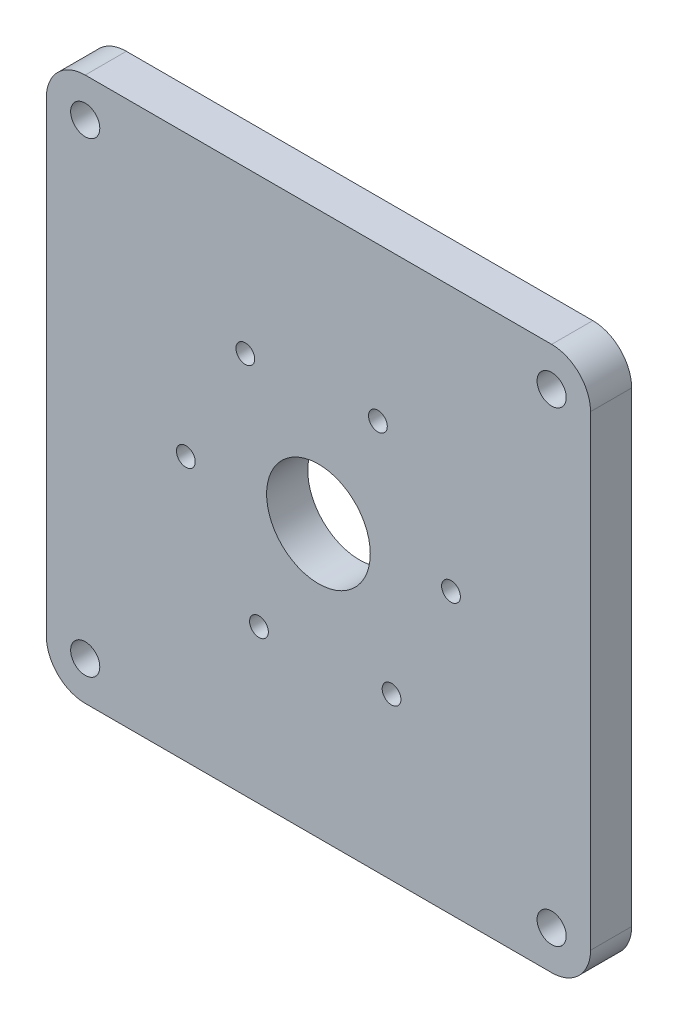
ISO-10303-21;
HEADER;
FILE_DESCRIPTION(('STEP AP214'),'2;1');
FILE_NAME('part.step','',(''),(''),'','','');
FILE_SCHEMA(('AUTOMOTIVE_DESIGN { 1 0 10303 214 1 1 1 1 }'));
ENDSEC;
DATA;
#1=APPLICATION_CONTEXT('core data for automotive mechanical design processes');
#2=APPLICATION_PROTOCOL_DEFINITION('international standard','automotive_design',2000,#1);
#3=PRODUCT_CONTEXT('',#1,'mechanical');
#4=PRODUCT('Part','Part','',(#3));
#5=PRODUCT_RELATED_PRODUCT_CATEGORY('part','',(#4));
#6=PRODUCT_DEFINITION_FORMATION('','',#4);
#7=PRODUCT_DEFINITION_CONTEXT('part definition',#1,'design');
#8=PRODUCT_DEFINITION('design','',#6,#7);
#9=PRODUCT_DEFINITION_SHAPE('','',#8);
#10=(LENGTH_UNIT() NAMED_UNIT(*) SI_UNIT(.MILLI.,.METRE.));
#11=(NAMED_UNIT(*) PLANE_ANGLE_UNIT() SI_UNIT($,.RADIAN.));
#12=(NAMED_UNIT(*) SI_UNIT($,.STERADIAN.) SOLID_ANGLE_UNIT());
#13=UNCERTAINTY_MEASURE_WITH_UNIT(LENGTH_MEASURE(1.E-05),#10,'distance_accuracy_value','');
#14=(GEOMETRIC_REPRESENTATION_CONTEXT(3) GLOBAL_UNCERTAINTY_ASSIGNED_CONTEXT((#13)) GLOBAL_UNIT_ASSIGNED_CONTEXT((#10,
#11,#12)) REPRESENTATION_CONTEXT('',''));
#15=CARTESIAN_POINT('',(0.,0.,0.));
#16=DIRECTION('',(0.,0.,1.));
#17=DIRECTION('',(1.,0.,0.));
#18=AXIS2_PLACEMENT_3D('',#15,#16,#17);
#19=CARTESIAN_POINT('',(-36.,-36.,42.85));
#20=DIRECTION('',(0.,0.,-1.));
#21=DIRECTION('',(-1.,0.,0.));
#22=AXIS2_PLACEMENT_3D('',#19,#20,#21);
#23=CYLINDRICAL_SURFACE('',#22,6.);
#24=CARTESIAN_POINT('',(-36.,-36.,36.5));
#25=DIRECTION('',(0.,0.,1.));
#26=DIRECTION('',(1.,0.,0.));
#27=AXIS2_PLACEMENT_3D('',#24,#25,#26);
#28=CIRCLE('',#27,6.);
#29=CARTESIAN_POINT('',(-42.,-36.,36.5));
#30=VERTEX_POINT('',#29);
#31=CARTESIAN_POINT('',(-36.,-42.,36.5));
#32=VERTEX_POINT('',#31);
#33=EDGE_CURVE('E146',#30,#32,#28,.T.);
#34=ORIENTED_EDGE('',*,*,#33,.T.);
#35=DIRECTION('',(0.,0.,-1.));
#36=VECTOR('',#35,1.);
#37=CARTESIAN_POINT('',(-36.,-42.,42.85));
#38=LINE('',#37,#36);
#39=CARTESIAN_POINT('',(-36.,-42.,42.85));
#40=VERTEX_POINT('',#39);
#41=EDGE_CURVE('E11',#40,#32,#38,.T.);
#42=ORIENTED_EDGE('',*,*,#41,.F.);
#43=CARTESIAN_POINT('',(-36.,-36.,42.85));
#44=DIRECTION('',(0.,0.,1.));
#45=DIRECTION('',(1.,0.,0.));
#46=AXIS2_PLACEMENT_3D('',#43,#44,#45);
#47=CIRCLE('',#46,6.);
#48=CARTESIAN_POINT('',(-42.,-36.,42.85));
#49=VERTEX_POINT('',#48);
#50=EDGE_CURVE('E172',#49,#40,#47,.T.);
#51=ORIENTED_EDGE('',*,*,#50,.F.);
#52=DIRECTION('',(0.,0.,-1.));
#53=VECTOR('',#52,1.);
#54=CARTESIAN_POINT('',(-42.,-36.,42.85));
#55=LINE('',#54,#53);
#56=EDGE_CURVE('E145',#49,#30,#55,.T.);
#57=ORIENTED_EDGE('',*,*,#56,.T.);
#58=EDGE_LOOP('',(#34,#42,#51,#57));
#59=FACE_BOUND('',#58,.T.);
#60=ADVANCED_FACE('F44',(#59),#23,.T.);
#61=CARTESIAN_POINT('',(-36.,-42.,42.85));
#62=DIRECTION('',(0.,1.,0.));
#63=DIRECTION('',(0.,0.,1.));
#64=AXIS2_PLACEMENT_3D('',#61,#62,#63);
#65=PLANE('',#64);
#66=DIRECTION('',(1.,0.,0.));
#67=VECTOR('',#66,1.);
#68=CARTESIAN_POINT('',(-36.,-42.,36.5));
#69=LINE('',#68,#67);
#70=CARTESIAN_POINT('',(36.,-42.,36.5));
#71=VERTEX_POINT('',#70);
#72=EDGE_CURVE('E155',#32,#71,#69,.T.);
#73=ORIENTED_EDGE('',*,*,#72,.T.);
#74=DIRECTION('',(0.,0.,-1.));
#75=VECTOR('',#74,1.);
#76=CARTESIAN_POINT('',(36.,-42.,42.85));
#77=LINE('',#76,#75);
#78=CARTESIAN_POINT('',(36.,-42.,42.85));
#79=VERTEX_POINT('',#78);
#80=EDGE_CURVE('E54',#79,#71,#77,.T.);
#81=ORIENTED_EDGE('',*,*,#80,.F.);
#82=DIRECTION('',(1.,0.,0.));
#83=VECTOR('',#82,1.);
#84=CARTESIAN_POINT('',(-36.,-42.,42.85));
#85=LINE('',#84,#83);
#86=EDGE_CURVE('E110',#40,#79,#85,.T.);
#87=ORIENTED_EDGE('',*,*,#86,.F.);
#88=ORIENTED_EDGE('',*,*,#41,.T.);
#89=EDGE_LOOP('',(#73,#81,#87,#88));
#90=FACE_BOUND('',#89,.T.);
#91=ADVANCED_FACE('F356',(#90),#65,.F.);
#92=CARTESIAN_POINT('',(36.,-36.,42.85));
#93=DIRECTION('',(0.,0.,-1.));
#94=DIRECTION('',(-1.,0.,0.));
#95=AXIS2_PLACEMENT_3D('',#92,#93,#94);
#96=CYLINDRICAL_SURFACE('',#95,6.);
#97=CARTESIAN_POINT('',(36.,-36.,36.5));
#98=DIRECTION('',(0.,0.,1.));
#99=DIRECTION('',(1.,0.,0.));
#100=AXIS2_PLACEMENT_3D('',#97,#98,#99);
#101=CIRCLE('',#100,6.);
#102=CARTESIAN_POINT('',(42.,-36.,36.5));
#103=VERTEX_POINT('',#102);
#104=EDGE_CURVE('E156',#71,#103,#101,.T.);
#105=ORIENTED_EDGE('',*,*,#104,.T.);
#106=DIRECTION('',(0.,0.,-1.));
#107=VECTOR('',#106,1.);
#108=CARTESIAN_POINT('',(42.,-36.,42.85));
#109=LINE('',#108,#107);
#110=CARTESIAN_POINT('',(42.,-36.,42.85));
#111=VERTEX_POINT('',#110);
#112=EDGE_CURVE('E185',#111,#103,#109,.T.);
#113=ORIENTED_EDGE('',*,*,#112,.F.);
#114=CARTESIAN_POINT('',(36.,-36.,42.85));
#115=DIRECTION('',(0.,0.,1.));
#116=DIRECTION('',(1.,0.,0.));
#117=AXIS2_PLACEMENT_3D('',#114,#115,#116);
#118=CIRCLE('',#117,6.);
#119=EDGE_CURVE('E285',#79,#111,#118,.T.);
#120=ORIENTED_EDGE('',*,*,#119,.F.);
#121=ORIENTED_EDGE('',*,*,#80,.T.);
#122=EDGE_LOOP('',(#105,#113,#120,#121));
#123=FACE_BOUND('',#122,.T.);
#124=ADVANCED_FACE('F361',(#123),#96,.T.);
#125=CARTESIAN_POINT('',(42.,-36.,42.85));
#126=DIRECTION('',(-1.,0.,0.));
#127=DIRECTION('',(0.,0.,1.));
#128=AXIS2_PLACEMENT_3D('',#125,#126,#127);
#129=PLANE('',#128);
#130=DIRECTION('',(0.,1.,0.));
#131=VECTOR('',#130,1.);
#132=CARTESIAN_POINT('',(42.,-36.,36.5));
#133=LINE('',#132,#131);
#134=CARTESIAN_POINT('',(42.,36.,36.5));
#135=VERTEX_POINT('',#134);
#136=EDGE_CURVE('E157',#103,#135,#133,.T.);
#137=ORIENTED_EDGE('',*,*,#136,.T.);
#138=DIRECTION('',(0.,0.,-1.));
#139=VECTOR('',#138,1.);
#140=CARTESIAN_POINT('',(42.,36.,42.85));
#141=LINE('',#140,#139);
#142=CARTESIAN_POINT('',(42.,36.,42.85));
#143=VERTEX_POINT('',#142);
#144=EDGE_CURVE('E176',#143,#135,#141,.T.);
#145=ORIENTED_EDGE('',*,*,#144,.F.);
#146=DIRECTION('',(0.,1.,0.));
#147=VECTOR('',#146,1.);
#148=CARTESIAN_POINT('',(42.,-36.,42.85));
#149=LINE('',#148,#147);
#150=EDGE_CURVE('E281',#111,#143,#149,.T.);
#151=ORIENTED_EDGE('',*,*,#150,.F.);
#152=ORIENTED_EDGE('',*,*,#112,.T.);
#153=EDGE_LOOP('',(#137,#145,#151,#152));
#154=FACE_BOUND('',#153,.T.);
#155=ADVANCED_FACE('F380',(#154),#129,.F.);
#156=CARTESIAN_POINT('',(36.,36.,42.85));
#157=DIRECTION('',(0.,0.,-1.));
#158=DIRECTION('',(-1.,0.,0.));
#159=AXIS2_PLACEMENT_3D('',#156,#157,#158);
#160=CYLINDRICAL_SURFACE('',#159,6.);
#161=CARTESIAN_POINT('',(36.,36.,36.5));
#162=DIRECTION('',(0.,0.,1.));
#163=DIRECTION('',(1.,0.,0.));
#164=AXIS2_PLACEMENT_3D('',#161,#162,#163);
#165=CIRCLE('',#164,6.);
#166=CARTESIAN_POINT('',(36.,42.,36.5));
#167=VERTEX_POINT('',#166);
#168=EDGE_CURVE('E165',#135,#167,#165,.T.);
#169=ORIENTED_EDGE('',*,*,#168,.T.);
#170=DIRECTION('',(0.,0.,-1.));
#171=VECTOR('',#170,1.);
#172=CARTESIAN_POINT('',(36.,42.,42.85));
#173=LINE('',#172,#171);
#174=CARTESIAN_POINT('',(36.,42.,42.85));
#175=VERTEX_POINT('',#174);
#176=EDGE_CURVE('E140',#175,#167,#173,.T.);
#177=ORIENTED_EDGE('',*,*,#176,.F.);
#178=CARTESIAN_POINT('',(36.,36.,42.85));
#179=DIRECTION('',(0.,0.,1.));
#180=DIRECTION('',(1.,0.,0.));
#181=AXIS2_PLACEMENT_3D('',#178,#179,#180);
#182=CIRCLE('',#181,6.);
#183=EDGE_CURVE('E127',#143,#175,#182,.T.);
#184=ORIENTED_EDGE('',*,*,#183,.F.);
#185=ORIENTED_EDGE('',*,*,#144,.T.);
#186=EDGE_LOOP('',(#169,#177,#184,#185));
#187=FACE_BOUND('',#186,.T.);
#188=ADVANCED_FACE('F379',(#187),#160,.T.);
#189=CARTESIAN_POINT('',(36.,42.,42.85));
#190=DIRECTION('',(0.,-1.,0.));
#191=DIRECTION('',(0.,0.,-1.));
#192=AXIS2_PLACEMENT_3D('',#189,#190,#191);
#193=PLANE('',#192);
#194=DIRECTION('',(-1.,0.,0.));
#195=VECTOR('',#194,1.);
#196=CARTESIAN_POINT('',(36.,42.,36.5));
#197=LINE('',#196,#195);
#198=CARTESIAN_POINT('',(-36.,42.,36.5));
#199=VERTEX_POINT('',#198);
#200=EDGE_CURVE('E131',#167,#199,#197,.T.);
#201=ORIENTED_EDGE('',*,*,#200,.T.);
#202=DIRECTION('',(0.,0.,-1.));
#203=VECTOR('',#202,1.);
#204=CARTESIAN_POINT('',(-36.,42.,42.85));
#205=LINE('',#204,#203);
#206=CARTESIAN_POINT('',(-36.,42.,42.85));
#207=VERTEX_POINT('',#206);
#208=EDGE_CURVE('E135',#207,#199,#205,.T.);
#209=ORIENTED_EDGE('',*,*,#208,.F.);
#210=DIRECTION('',(-1.,0.,0.));
#211=VECTOR('',#210,1.);
#212=CARTESIAN_POINT('',(36.,42.,42.85));
#213=LINE('',#212,#211);
#214=EDGE_CURVE('E116',#175,#207,#213,.T.);
#215=ORIENTED_EDGE('',*,*,#214,.F.);
#216=ORIENTED_EDGE('',*,*,#176,.T.);
#217=EDGE_LOOP('',(#201,#209,#215,#216));
#218=FACE_BOUND('',#217,.T.);
#219=ADVANCED_FACE('F133',(#218),#193,.F.);
#220=CARTESIAN_POINT('',(-36.,36.,42.85));
#221=DIRECTION('',(0.,0.,-1.));
#222=DIRECTION('',(-1.,0.,0.));
#223=AXIS2_PLACEMENT_3D('',#220,#221,#222);
#224=CYLINDRICAL_SURFACE('',#223,6.);
#225=CARTESIAN_POINT('',(-36.,36.,36.5));
#226=DIRECTION('',(0.,0.,1.));
#227=DIRECTION('',(1.,0.,0.));
#228=AXIS2_PLACEMENT_3D('',#225,#226,#227);
#229=CIRCLE('',#228,6.);
#230=CARTESIAN_POINT('',(-42.,36.,36.5));
#231=VERTEX_POINT('',#230);
#232=EDGE_CURVE('E91',#199,#231,#229,.T.);
#233=ORIENTED_EDGE('',*,*,#232,.T.);
#234=DIRECTION('',(0.,0.,-1.));
#235=VECTOR('',#234,1.);
#236=CARTESIAN_POINT('',(-42.,36.,42.85));
#237=LINE('',#236,#235);
#238=CARTESIAN_POINT('',(-42.,36.,42.85));
#239=VERTEX_POINT('',#238);
#240=EDGE_CURVE('E136',#239,#231,#237,.T.);
#241=ORIENTED_EDGE('',*,*,#240,.F.);
#242=CARTESIAN_POINT('',(-36.,36.,42.85));
#243=DIRECTION('',(0.,0.,1.));
#244=DIRECTION('',(1.,0.,0.));
#245=AXIS2_PLACEMENT_3D('',#242,#243,#244);
#246=CIRCLE('',#245,6.);
#247=EDGE_CURVE('E124',#207,#239,#246,.T.);
#248=ORIENTED_EDGE('',*,*,#247,.F.);
#249=ORIENTED_EDGE('',*,*,#208,.T.);
#250=EDGE_LOOP('',(#233,#241,#248,#249));
#251=FACE_BOUND('',#250,.T.);
#252=ADVANCED_FACE('F137',(#251),#224,.T.);
#253=CARTESIAN_POINT('',(-42.,36.,42.85));
#254=DIRECTION('',(1.,0.,0.));
#255=DIRECTION('',(0.,0.,-1.));
#256=AXIS2_PLACEMENT_3D('',#253,#254,#255);
#257=PLANE('',#256);
#258=DIRECTION('',(0.,-1.,0.));
#259=VECTOR('',#258,1.);
#260=CARTESIAN_POINT('',(-42.,36.,36.5));
#261=LINE('',#260,#259);
#262=EDGE_CURVE('E97',#231,#30,#261,.T.);
#263=ORIENTED_EDGE('',*,*,#262,.T.);
#264=ORIENTED_EDGE('',*,*,#56,.F.);
#265=DIRECTION('',(0.,-1.,0.));
#266=VECTOR('',#265,1.);
#267=CARTESIAN_POINT('',(-42.,36.,42.85));
#268=LINE('',#267,#266);
#269=EDGE_CURVE('E64',#239,#49,#268,.T.);
#270=ORIENTED_EDGE('',*,*,#269,.F.);
#271=ORIENTED_EDGE('',*,*,#240,.T.);
#272=EDGE_LOOP('',(#263,#264,#270,#271));
#273=FACE_BOUND('',#272,.T.);
#274=ADVANCED_FACE('F423',(#273),#257,.F.);
#275=CARTESIAN_POINT('',(-36.,-36.,42.85));
#276=DIRECTION('',(0.,0.,1.));
#277=DIRECTION('',(1.,0.,0.));
#278=AXIS2_PLACEMENT_3D('',#275,#276,#277);
#279=PLANE('',#278);
#280=CARTESIAN_POINT('',(-9.17906130069477,-18.3301618552071,42.85));
#281=DIRECTION('',(0.,0.,1.));
#282=DIRECTION('',(1.,0.,0.));
#283=AXIS2_PLACEMENT_3D('',#280,#281,#282);
#284=CIRCLE('',#283,1.45);
#285=CARTESIAN_POINT('',(-7.72906130069477,-18.3301618552071,42.85));
#286=VERTEX_POINT('',#285);
#287=EDGE_CURVE('E238',#286,#286,#284,.T.);
#288=ORIENTED_EDGE('',*,*,#287,.F.);
#289=EDGE_LOOP('',(#288));
#290=FACE_BOUND('',#289,.T.);
#291=CARTESIAN_POINT('',(-20.4639164724372,-1.21578065830722,42.85));
#292=DIRECTION('',(0.,0.,1.));
#293=DIRECTION('',(1.,0.,0.));
#294=AXIS2_PLACEMENT_3D('',#291,#292,#293);
#295=CIRCLE('',#294,1.45);
#296=CARTESIAN_POINT('',(-19.0139164724372,-1.21578065830722,42.85));
#297=VERTEX_POINT('',#296);
#298=EDGE_CURVE('E237',#297,#297,#295,.T.);
#299=ORIENTED_EDGE('',*,*,#298,.F.);
#300=EDGE_LOOP('',(#299));
#301=FACE_BOUND('',#300,.T.);
#302=CARTESIAN_POINT('',(-11.2848551717424,17.1143811968998,42.85));
#303=DIRECTION('',(0.,0.,1.));
#304=DIRECTION('',(1.,0.,0.));
#305=AXIS2_PLACEMENT_3D('',#302,#303,#304);
#306=CIRCLE('',#305,1.45);
#307=CARTESIAN_POINT('',(-9.83485517174241,17.1143811968998,42.85));
#308=VERTEX_POINT('',#307);
#309=EDGE_CURVE('E235',#308,#308,#306,.T.);
#310=ORIENTED_EDGE('',*,*,#309,.F.);
#311=EDGE_LOOP('',(#310));
#312=FACE_BOUND('',#311,.T.);
#313=CARTESIAN_POINT('',(9.17906130069478,18.330161855207,42.85));
#314=DIRECTION('',(0.,0.,1.));
#315=DIRECTION('',(1.,0.,0.));
#316=AXIS2_PLACEMENT_3D('',#313,#314,#315);
#317=CIRCLE('',#316,1.45);
#318=CARTESIAN_POINT('',(10.6290613006948,18.330161855207,42.85));
#319=VERTEX_POINT('',#318);
#320=EDGE_CURVE('E230',#319,#319,#317,.T.);
#321=ORIENTED_EDGE('',*,*,#320,.F.);
#322=EDGE_LOOP('',(#321));
#323=FACE_BOUND('',#322,.T.);
#324=CARTESIAN_POINT('',(-36.,36.,42.85));
#325=DIRECTION('',(0.,0.,1.));
#326=DIRECTION('',(1.,0.,0.));
#327=AXIS2_PLACEMENT_3D('',#324,#325,#326);
#328=CIRCLE('',#327,2.25);
#329=CARTESIAN_POINT('',(-33.75,36.,42.85));
#330=VERTEX_POINT('',#329);
#331=EDGE_CURVE('E261',#330,#330,#328,.T.);
#332=ORIENTED_EDGE('',*,*,#331,.F.);
#333=EDGE_LOOP('',(#332));
#334=FACE_BOUND('',#333,.T.);
#335=CARTESIAN_POINT('',(36.,-36.,42.85));
#336=DIRECTION('',(0.,0.,1.));
#337=DIRECTION('',(1.,0.,0.));
#338=AXIS2_PLACEMENT_3D('',#335,#336,#337);
#339=CIRCLE('',#338,2.25);
#340=CARTESIAN_POINT('',(38.25,-36.,42.85));
#341=VERTEX_POINT('',#340);
#342=EDGE_CURVE('E246',#341,#341,#339,.T.);
#343=ORIENTED_EDGE('',*,*,#342,.F.);
#344=EDGE_LOOP('',(#343));
#345=FACE_BOUND('',#344,.T.);
#346=CARTESIAN_POINT('',(36.,36.,42.85));
#347=DIRECTION('',(0.,0.,1.));
#348=DIRECTION('',(1.,0.,0.));
#349=AXIS2_PLACEMENT_3D('',#346,#347,#348);
#350=CIRCLE('',#349,2.25);
#351=CARTESIAN_POINT('',(38.25,36.,42.85));
#352=VERTEX_POINT('',#351);
#353=EDGE_CURVE('E249',#352,#352,#350,.T.);
#354=ORIENTED_EDGE('',*,*,#353,.F.);
#355=EDGE_LOOP('',(#354));
#356=FACE_BOUND('',#355,.T.);
#357=CARTESIAN_POINT('',(20.4639164724372,1.21578065830721,42.85));
#358=DIRECTION('',(0.,0.,1.));
#359=DIRECTION('',(1.,0.,0.));
#360=AXIS2_PLACEMENT_3D('',#357,#358,#359);
#361=CIRCLE('',#360,1.45);
#362=CARTESIAN_POINT('',(21.9139164724372,1.21578065830721,42.85));
#363=VERTEX_POINT('',#362);
#364=EDGE_CURVE('E233',#363,#363,#361,.T.);
#365=ORIENTED_EDGE('',*,*,#364,.F.);
#366=EDGE_LOOP('',(#365));
#367=FACE_BOUND('',#366,.T.);
#368=CARTESIAN_POINT('',(11.2848551717424,-17.1143811968998,42.85));
#369=DIRECTION('',(0.,0.,1.));
#370=DIRECTION('',(1.,0.,0.));
#371=AXIS2_PLACEMENT_3D('',#368,#369,#370);
#372=CIRCLE('',#371,1.45);
#373=CARTESIAN_POINT('',(12.7348551717424,-17.1143811968998,42.85));
#374=VERTEX_POINT('',#373);
#375=EDGE_CURVE('E224',#374,#374,#372,.T.);
#376=ORIENTED_EDGE('',*,*,#375,.F.);
#377=EDGE_LOOP('',(#376));
#378=FACE_BOUND('',#377,.T.);
#379=CARTESIAN_POINT('',(0.,0.,42.85));
#380=DIRECTION('',(0.,0.,1.));
#381=DIRECTION('',(1.,0.,0.));
#382=AXIS2_PLACEMENT_3D('',#379,#380,#381);
#383=CIRCLE('',#382,8.);
#384=CARTESIAN_POINT('',(8.,0.,42.85));
#385=VERTEX_POINT('',#384);
#386=EDGE_CURVE('E215',#385,#385,#383,.T.);
#387=ORIENTED_EDGE('',*,*,#386,.F.);
#388=EDGE_LOOP('',(#387));
#389=FACE_BOUND('',#388,.T.);
#390=CARTESIAN_POINT('',(-36.,-36.,42.85));
#391=DIRECTION('',(0.,0.,1.));
#392=DIRECTION('',(1.,0.,0.));
#393=AXIS2_PLACEMENT_3D('',#390,#391,#392);
#394=CIRCLE('',#393,2.25);
#395=CARTESIAN_POINT('',(-33.75,-36.,42.85));
#396=VERTEX_POINT('',#395);
#397=EDGE_CURVE('E153',#396,#396,#394,.T.);
#398=ORIENTED_EDGE('',*,*,#397,.F.);
#399=EDGE_LOOP('',(#398));
#400=FACE_BOUND('',#399,.T.);
#401=ORIENTED_EDGE('',*,*,#50,.T.);
#402=ORIENTED_EDGE('',*,*,#86,.T.);
#403=ORIENTED_EDGE('',*,*,#119,.T.);
#404=ORIENTED_EDGE('',*,*,#150,.T.);
#405=ORIENTED_EDGE('',*,*,#183,.T.);
#406=ORIENTED_EDGE('',*,*,#214,.T.);
#407=ORIENTED_EDGE('',*,*,#247,.T.);
#408=ORIENTED_EDGE('',*,*,#269,.T.);
#409=EDGE_LOOP('',(#401,#402,#403,#404,#405,#406,#407,#408));
#410=FACE_BOUND('',#409,.T.);
#411=ADVANCED_FACE('F125',(#290,#301,#312,#323,#334,#345,#356,#367,#378,#389,#400,#410),#279,.T.);
#412=CARTESIAN_POINT('',(-36.,-36.,36.5));
#413=DIRECTION('',(0.,0.,1.));
#414=DIRECTION('',(1.,0.,0.));
#415=AXIS2_PLACEMENT_3D('',#412,#413,#414);
#416=PLANE('',#415);
#417=CARTESIAN_POINT('',(20.4639164724372,1.21578065830721,36.5));
#418=DIRECTION('',(0.,0.,1.));
#419=DIRECTION('',(1.,0.,0.));
#420=AXIS2_PLACEMENT_3D('',#417,#418,#419);
#421=CIRCLE('',#420,2.5);
#422=CARTESIAN_POINT('',(22.9639164724372,1.21578065830721,36.5));
#423=VERTEX_POINT('',#422);
#424=EDGE_CURVE('E326',#423,#423,#421,.T.);
#425=ORIENTED_EDGE('',*,*,#424,.T.);
#426=EDGE_LOOP('',(#425));
#427=FACE_BOUND('',#426,.T.);
#428=CARTESIAN_POINT('',(11.2848551717424,-17.1143811968998,36.5));
#429=DIRECTION('',(0.,0.,1.));
#430=DIRECTION('',(1.,0.,0.));
#431=AXIS2_PLACEMENT_3D('',#428,#429,#430);
#432=CIRCLE('',#431,2.5);
#433=CARTESIAN_POINT('',(13.7848551717424,-17.1143811968998,36.5));
#434=VERTEX_POINT('',#433);
#435=EDGE_CURVE('E298',#434,#434,#432,.T.);
#436=ORIENTED_EDGE('',*,*,#435,.T.);
#437=EDGE_LOOP('',(#436));
#438=FACE_BOUND('',#437,.T.);
#439=CARTESIAN_POINT('',(-9.17906130069477,-18.3301618552071,36.5));
#440=DIRECTION('',(0.,0.,1.));
#441=DIRECTION('',(1.,0.,0.));
#442=AXIS2_PLACEMENT_3D('',#439,#440,#441);
#443=CIRCLE('',#442,2.5);
#444=CARTESIAN_POINT('',(-6.67906130069477,-18.3301618552071,36.5));
#445=VERTEX_POINT('',#444);
#446=EDGE_CURVE('E300',#445,#445,#443,.T.);
#447=ORIENTED_EDGE('',*,*,#446,.T.);
#448=EDGE_LOOP('',(#447));
#449=FACE_BOUND('',#448,.T.);
#450=CARTESIAN_POINT('',(-20.4639164724372,-1.21578065830722,36.5));
#451=DIRECTION('',(0.,0.,1.));
#452=DIRECTION('',(1.,0.,0.));
#453=AXIS2_PLACEMENT_3D('',#450,#451,#452);
#454=CIRCLE('',#453,2.5);
#455=CARTESIAN_POINT('',(-17.9639164724372,-1.21578065830722,36.5));
#456=VERTEX_POINT('',#455);
#457=EDGE_CURVE('E308',#456,#456,#454,.T.);
#458=ORIENTED_EDGE('',*,*,#457,.T.);
#459=EDGE_LOOP('',(#458));
#460=FACE_BOUND('',#459,.T.);
#461=CARTESIAN_POINT('',(-11.2848551717424,17.1143811968998,36.5));
#462=DIRECTION('',(0.,0.,1.));
#463=DIRECTION('',(1.,0.,0.));
#464=AXIS2_PLACEMENT_3D('',#461,#462,#463);
#465=CIRCLE('',#464,2.5);
#466=CARTESIAN_POINT('',(-8.78485517174241,17.1143811968998,36.5));
#467=VERTEX_POINT('',#466);
#468=EDGE_CURVE('E314',#467,#467,#465,.T.);
#469=ORIENTED_EDGE('',*,*,#468,.T.);
#470=EDGE_LOOP('',(#469));
#471=FACE_BOUND('',#470,.T.);
#472=CARTESIAN_POINT('',(9.17906130069478,18.330161855207,36.5));
#473=DIRECTION('',(0.,0.,1.));
#474=DIRECTION('',(1.,0.,0.));
#475=AXIS2_PLACEMENT_3D('',#472,#473,#474);
#476=CIRCLE('',#475,2.5);
#477=CARTESIAN_POINT('',(11.6790613006948,18.330161855207,36.5));
#478=VERTEX_POINT('',#477);
#479=EDGE_CURVE('E325',#478,#478,#476,.T.);
#480=ORIENTED_EDGE('',*,*,#479,.T.);
#481=EDGE_LOOP('',(#480));
#482=FACE_BOUND('',#481,.T.);
#483=CARTESIAN_POINT('',(-36.,36.,36.5));
#484=DIRECTION('',(0.,0.,1.));
#485=DIRECTION('',(1.,0.,0.));
#486=AXIS2_PLACEMENT_3D('',#483,#484,#485);
#487=CIRCLE('',#486,2.25);
#488=CARTESIAN_POINT('',(-33.75,36.,36.5));
#489=VERTEX_POINT('',#488);
#490=EDGE_CURVE('E258',#489,#489,#487,.T.);
#491=ORIENTED_EDGE('',*,*,#490,.T.);
#492=EDGE_LOOP('',(#491));
#493=FACE_BOUND('',#492,.T.);
#494=CARTESIAN_POINT('',(36.,-36.,36.5));
#495=DIRECTION('',(0.,0.,1.));
#496=DIRECTION('',(1.,0.,0.));
#497=AXIS2_PLACEMENT_3D('',#494,#495,#496);
#498=CIRCLE('',#497,2.25);
#499=CARTESIAN_POINT('',(38.25,-36.,36.5));
#500=VERTEX_POINT('',#499);
#501=EDGE_CURVE('E264',#500,#500,#498,.T.);
#502=ORIENTED_EDGE('',*,*,#501,.T.);
#503=EDGE_LOOP('',(#502));
#504=FACE_BOUND('',#503,.T.);
#505=CARTESIAN_POINT('',(36.,36.,36.5));
#506=DIRECTION('',(0.,0.,1.));
#507=DIRECTION('',(1.,0.,0.));
#508=AXIS2_PLACEMENT_3D('',#505,#506,#507);
#509=CIRCLE('',#508,2.25);
#510=CARTESIAN_POINT('',(38.25,36.,36.5));
#511=VERTEX_POINT('',#510);
#512=EDGE_CURVE('E244',#511,#511,#509,.T.);
#513=ORIENTED_EDGE('',*,*,#512,.T.);
#514=EDGE_LOOP('',(#513));
#515=FACE_BOUND('',#514,.T.);
#516=CARTESIAN_POINT('',(0.,0.,36.5));
#517=DIRECTION('',(0.,0.,1.));
#518=DIRECTION('',(1.,0.,0.));
#519=AXIS2_PLACEMENT_3D('',#516,#517,#518);
#520=CIRCLE('',#519,8.);
#521=CARTESIAN_POINT('',(8.,0.,36.5));
#522=VERTEX_POINT('',#521);
#523=EDGE_CURVE('E220',#522,#522,#520,.T.);
#524=ORIENTED_EDGE('',*,*,#523,.T.);
#525=EDGE_LOOP('',(#524));
#526=FACE_BOUND('',#525,.T.);
#527=CARTESIAN_POINT('',(-36.,-36.,36.5));
#528=DIRECTION('',(0.,0.,1.));
#529=DIRECTION('',(1.,0.,0.));
#530=AXIS2_PLACEMENT_3D('',#527,#528,#529);
#531=CIRCLE('',#530,2.25);
#532=CARTESIAN_POINT('',(-33.75,-36.,36.5));
#533=VERTEX_POINT('',#532);
#534=EDGE_CURVE('E257',#533,#533,#531,.T.);
#535=ORIENTED_EDGE('',*,*,#534,.T.);
#536=EDGE_LOOP('',(#535));
#537=FACE_BOUND('',#536,.T.);
#538=ORIENTED_EDGE('',*,*,#33,.F.);
#539=ORIENTED_EDGE('',*,*,#262,.F.);
#540=ORIENTED_EDGE('',*,*,#232,.F.);
#541=ORIENTED_EDGE('',*,*,#200,.F.);
#542=ORIENTED_EDGE('',*,*,#168,.F.);
#543=ORIENTED_EDGE('',*,*,#136,.F.);
#544=ORIENTED_EDGE('',*,*,#104,.F.);
#545=ORIENTED_EDGE('',*,*,#72,.F.);
#546=EDGE_LOOP('',(#538,#539,#540,#541,#542,#543,#544,#545));
#547=FACE_BOUND('',#546,.T.);
#548=ADVANCED_FACE('F366',(#427,#438,#449,#460,#471,#482,#493,#504,#515,#526,#537,#547),#416,.F.);
#549=CARTESIAN_POINT('',(-36.,-36.,42.85));
#550=DIRECTION('',(0.,0.,-1.));
#551=DIRECTION('',(-1.,0.,0.));
#552=AXIS2_PLACEMENT_3D('',#549,#550,#551);
#553=CYLINDRICAL_SURFACE('',#552,2.25);
#554=ORIENTED_EDGE('',*,*,#397,.T.);
#555=EDGE_LOOP('',(#554));
#556=FACE_BOUND('',#555,.T.);
#557=ORIENTED_EDGE('',*,*,#534,.F.);
#558=EDGE_LOOP('',(#557));
#559=FACE_BOUND('',#558,.T.);
#560=ADVANCED_FACE('F450',(#556,#559),#553,.F.);
#561=CARTESIAN_POINT('',(0.,0.,42.85));
#562=DIRECTION('',(0.,0.,-1.));
#563=DIRECTION('',(-1.,0.,0.));
#564=AXIS2_PLACEMENT_3D('',#561,#562,#563);
#565=CYLINDRICAL_SURFACE('',#564,8.);
#566=ORIENTED_EDGE('',*,*,#386,.T.);
#567=EDGE_LOOP('',(#566));
#568=FACE_BOUND('',#567,.T.);
#569=ORIENTED_EDGE('',*,*,#523,.F.);
#570=EDGE_LOOP('',(#569));
#571=FACE_BOUND('',#570,.T.);
#572=ADVANCED_FACE('F456',(#568,#571),#565,.F.);
#573=CARTESIAN_POINT('',(11.2848551717424,-17.1143811968998,42.85));
#574=DIRECTION('',(0.,0.,-1.));
#575=DIRECTION('',(-1.,0.,0.));
#576=AXIS2_PLACEMENT_3D('',#573,#574,#575);
#577=CYLINDRICAL_SURFACE('',#576,1.45);
#578=CARTESIAN_POINT('',(11.2848551717424,-17.1143811968998,39.1));
#579=DIRECTION('',(0.,0.,1.));
#580=DIRECTION('',(1.,0.,0.));
#581=AXIS2_PLACEMENT_3D('',#578,#579,#580);
#582=CIRCLE('',#581,1.45);
#583=CARTESIAN_POINT('',(12.7348551717424,-17.1143811968998,39.1));
#584=VERTEX_POINT('',#583);
#585=EDGE_CURVE('E48',#584,#584,#582,.T.);
#586=ORIENTED_EDGE('',*,*,#585,.F.);
#587=EDGE_LOOP('',(#586));
#588=FACE_BOUND('',#587,.T.);
#589=ORIENTED_EDGE('',*,*,#375,.T.);
#590=EDGE_LOOP('',(#589));
#591=FACE_BOUND('',#590,.T.);
#592=ADVANCED_FACE('F466',(#588,#591),#577,.F.);
#593=CARTESIAN_POINT('',(20.4639164724372,1.21578065830721,42.85));
#594=DIRECTION('',(0.,0.,-1.));
#595=DIRECTION('',(-1.,0.,0.));
#596=AXIS2_PLACEMENT_3D('',#593,#594,#595);
#597=CYLINDRICAL_SURFACE('',#596,1.45);
#598=CARTESIAN_POINT('',(20.4639164724372,1.21578065830721,39.1));
#599=DIRECTION('',(0.,0.,1.));
#600=DIRECTION('',(1.,0.,0.));
#601=AXIS2_PLACEMENT_3D('',#598,#599,#600);
#602=CIRCLE('',#601,1.45);
#603=CARTESIAN_POINT('',(21.9139164724372,1.21578065830721,39.1));
#604=VERTEX_POINT('',#603);
#605=EDGE_CURVE('E202',#604,#604,#602,.T.);
#606=ORIENTED_EDGE('',*,*,#605,.F.);
#607=EDGE_LOOP('',(#606));
#608=FACE_BOUND('',#607,.T.);
#609=ORIENTED_EDGE('',*,*,#364,.T.);
#610=EDGE_LOOP('',(#609));
#611=FACE_BOUND('',#610,.T.);
#612=ADVANCED_FACE('F480',(#608,#611),#597,.F.);
#613=CARTESIAN_POINT('',(36.,36.,42.85));
#614=DIRECTION('',(0.,0.,-1.));
#615=DIRECTION('',(-1.,0.,0.));
#616=AXIS2_PLACEMENT_3D('',#613,#614,#615);
#617=CYLINDRICAL_SURFACE('',#616,2.25);
#618=ORIENTED_EDGE('',*,*,#353,.T.);
#619=EDGE_LOOP('',(#618));
#620=FACE_BOUND('',#619,.T.);
#621=ORIENTED_EDGE('',*,*,#512,.F.);
#622=EDGE_LOOP('',(#621));
#623=FACE_BOUND('',#622,.T.);
#624=ADVANCED_FACE('F490',(#620,#623),#617,.F.);
#625=CARTESIAN_POINT('',(36.,-36.,42.85));
#626=DIRECTION('',(0.,0.,-1.));
#627=DIRECTION('',(-1.,0.,0.));
#628=AXIS2_PLACEMENT_3D('',#625,#626,#627);
#629=CYLINDRICAL_SURFACE('',#628,2.25);
#630=ORIENTED_EDGE('',*,*,#342,.T.);
#631=EDGE_LOOP('',(#630));
#632=FACE_BOUND('',#631,.T.);
#633=ORIENTED_EDGE('',*,*,#501,.F.);
#634=EDGE_LOOP('',(#633));
#635=FACE_BOUND('',#634,.T.);
#636=ADVANCED_FACE('F500',(#632,#635),#629,.F.);
#637=CARTESIAN_POINT('',(-36.,36.,42.85));
#638=DIRECTION('',(0.,0.,-1.));
#639=DIRECTION('',(-1.,0.,0.));
#640=AXIS2_PLACEMENT_3D('',#637,#638,#639);
#641=CYLINDRICAL_SURFACE('',#640,2.25);
#642=ORIENTED_EDGE('',*,*,#331,.T.);
#643=EDGE_LOOP('',(#642));
#644=FACE_BOUND('',#643,.T.);
#645=ORIENTED_EDGE('',*,*,#490,.F.);
#646=EDGE_LOOP('',(#645));
#647=FACE_BOUND('',#646,.T.);
#648=ADVANCED_FACE('F510',(#644,#647),#641,.F.);
#649=CARTESIAN_POINT('',(9.17906130069478,18.330161855207,42.85));
#650=DIRECTION('',(0.,0.,-1.));
#651=DIRECTION('',(-1.,0.,0.));
#652=AXIS2_PLACEMENT_3D('',#649,#650,#651);
#653=CYLINDRICAL_SURFACE('',#652,1.45);
#654=CARTESIAN_POINT('',(9.17906130069478,18.330161855207,39.1));
#655=DIRECTION('',(0.,0.,1.));
#656=DIRECTION('',(1.,0.,0.));
#657=AXIS2_PLACEMENT_3D('',#654,#655,#656);
#658=CIRCLE('',#657,1.45);
#659=CARTESIAN_POINT('',(10.6290613006948,18.330161855207,39.1));
#660=VERTEX_POINT('',#659);
#661=EDGE_CURVE('E205',#660,#660,#658,.T.);
#662=ORIENTED_EDGE('',*,*,#661,.F.);
#663=EDGE_LOOP('',(#662));
#664=FACE_BOUND('',#663,.T.);
#665=ORIENTED_EDGE('',*,*,#320,.T.);
#666=EDGE_LOOP('',(#665));
#667=FACE_BOUND('',#666,.T.);
#668=ADVANCED_FACE('F517',(#664,#667),#653,.F.);
#669=CARTESIAN_POINT('',(-11.2848551717424,17.1143811968998,42.85));
#670=DIRECTION('',(0.,0.,-1.));
#671=DIRECTION('',(-1.,0.,0.));
#672=AXIS2_PLACEMENT_3D('',#669,#670,#671);
#673=CYLINDRICAL_SURFACE('',#672,1.45);
#674=CARTESIAN_POINT('',(-11.2848551717424,17.1143811968998,39.1));
#675=DIRECTION('',(0.,0.,1.));
#676=DIRECTION('',(1.,0.,0.));
#677=AXIS2_PLACEMENT_3D('',#674,#675,#676);
#678=CIRCLE('',#677,1.45);
#679=CARTESIAN_POINT('',(-9.83485517174241,17.1143811968998,39.1));
#680=VERTEX_POINT('',#679);
#681=EDGE_CURVE('E196',#680,#680,#678,.T.);
#682=ORIENTED_EDGE('',*,*,#681,.F.);
#683=EDGE_LOOP('',(#682));
#684=FACE_BOUND('',#683,.T.);
#685=ORIENTED_EDGE('',*,*,#309,.T.);
#686=EDGE_LOOP('',(#685));
#687=FACE_BOUND('',#686,.T.);
#688=ADVANCED_FACE('F522',(#684,#687),#673,.F.);
#689=CARTESIAN_POINT('',(-20.4639164724372,-1.21578065830722,42.85));
#690=DIRECTION('',(0.,0.,-1.));
#691=DIRECTION('',(-1.,0.,0.));
#692=AXIS2_PLACEMENT_3D('',#689,#690,#691);
#693=CYLINDRICAL_SURFACE('',#692,1.45);
#694=CARTESIAN_POINT('',(-20.4639164724372,-1.21578065830722,39.1));
#695=DIRECTION('',(0.,0.,1.));
#696=DIRECTION('',(1.,0.,0.));
#697=AXIS2_PLACEMENT_3D('',#694,#695,#696);
#698=CIRCLE('',#697,1.45);
#699=CARTESIAN_POINT('',(-19.0139164724372,-1.21578065830722,39.1));
#700=VERTEX_POINT('',#699);
#701=EDGE_CURVE('E191',#700,#700,#698,.T.);
#702=ORIENTED_EDGE('',*,*,#701,.F.);
#703=EDGE_LOOP('',(#702));
#704=FACE_BOUND('',#703,.T.);
#705=ORIENTED_EDGE('',*,*,#298,.T.);
#706=EDGE_LOOP('',(#705));
#707=FACE_BOUND('',#706,.T.);
#708=ADVANCED_FACE('F532',(#704,#707),#693,.F.);
#709=CARTESIAN_POINT('',(-9.17906130069477,-18.3301618552071,42.85));
#710=DIRECTION('',(0.,0.,-1.));
#711=DIRECTION('',(-1.,0.,0.));
#712=AXIS2_PLACEMENT_3D('',#709,#710,#711);
#713=CYLINDRICAL_SURFACE('',#712,1.45);
#714=CARTESIAN_POINT('',(-9.17906130069477,-18.3301618552071,39.1));
#715=DIRECTION('',(0.,0.,1.));
#716=DIRECTION('',(1.,0.,0.));
#717=AXIS2_PLACEMENT_3D('',#714,#715,#716);
#718=CIRCLE('',#717,1.45);
#719=CARTESIAN_POINT('',(-7.72906130069477,-18.3301618552071,39.1));
#720=VERTEX_POINT('',#719);
#721=EDGE_CURVE('E189',#720,#720,#718,.T.);
#722=ORIENTED_EDGE('',*,*,#721,.F.);
#723=EDGE_LOOP('',(#722));
#724=FACE_BOUND('',#723,.T.);
#725=ORIENTED_EDGE('',*,*,#287,.T.);
#726=EDGE_LOOP('',(#725));
#727=FACE_BOUND('',#726,.T.);
#728=ADVANCED_FACE('F544',(#724,#727),#713,.F.);
#729=CARTESIAN_POINT('',(-9.17906130069477,-18.3301618552071,39.1));
#730=DIRECTION('',(0.,0.,-1.));
#731=DIRECTION('',(-1.,0.,0.));
#732=AXIS2_PLACEMENT_3D('',#729,#730,#731);
#733=CYLINDRICAL_SURFACE('',#732,2.5);
#734=CARTESIAN_POINT('',(-9.17906130069477,-18.3301618552071,39.1));
#735=DIRECTION('',(0.,0.,1.));
#736=DIRECTION('',(1.,0.,0.));
#737=AXIS2_PLACEMENT_3D('',#734,#735,#736);
#738=CIRCLE('',#737,2.5);
#739=CARTESIAN_POINT('',(-6.67906130069477,-18.3301618552071,39.1));
#740=VERTEX_POINT('',#739);
#741=EDGE_CURVE('E291',#740,#740,#738,.T.);
#742=ORIENTED_EDGE('',*,*,#741,.T.);
#743=EDGE_LOOP('',(#742));
#744=FACE_BOUND('',#743,.T.);
#745=ORIENTED_EDGE('',*,*,#446,.F.);
#746=EDGE_LOOP('',(#745));
#747=FACE_BOUND('',#746,.T.);
#748=ADVANCED_FACE('F553',(#744,#747),#733,.F.);
#749=CARTESIAN_POINT('',(-9.17906130069477,-18.3301618552071,39.1));
#750=DIRECTION('',(0.,0.,1.));
#751=DIRECTION('',(1.,0.,0.));
#752=AXIS2_PLACEMENT_3D('',#749,#750,#751);
#753=PLANE('',#752);
#754=ORIENTED_EDGE('',*,*,#721,.T.);
#755=EDGE_LOOP('',(#754));
#756=FACE_BOUND('',#755,.T.);
#757=ORIENTED_EDGE('',*,*,#741,.F.);
#758=EDGE_LOOP('',(#757));
#759=FACE_BOUND('',#758,.T.);
#760=ADVANCED_FACE('F562',(#756,#759),#753,.F.);
#761=CARTESIAN_POINT('',(-20.4639164724372,-1.21578065830722,39.1));
#762=DIRECTION('',(0.,0.,-1.));
#763=DIRECTION('',(-1.,0.,0.));
#764=AXIS2_PLACEMENT_3D('',#761,#762,#763);
#765=CYLINDRICAL_SURFACE('',#764,2.5);
#766=CARTESIAN_POINT('',(-20.4639164724372,-1.21578065830722,39.1));
#767=DIRECTION('',(0.,0.,1.));
#768=DIRECTION('',(1.,0.,0.));
#769=AXIS2_PLACEMENT_3D('',#766,#767,#768);
#770=CIRCLE('',#769,2.5);
#771=CARTESIAN_POINT('',(-17.9639164724372,-1.21578065830722,39.1));
#772=VERTEX_POINT('',#771);
#773=EDGE_CURVE('E305',#772,#772,#770,.T.);
#774=ORIENTED_EDGE('',*,*,#773,.T.);
#775=EDGE_LOOP('',(#774));
#776=FACE_BOUND('',#775,.T.);
#777=ORIENTED_EDGE('',*,*,#457,.F.);
#778=EDGE_LOOP('',(#777));
#779=FACE_BOUND('',#778,.T.);
#780=ADVANCED_FACE('F571',(#776,#779),#765,.F.);
#781=CARTESIAN_POINT('',(-20.4639164724372,-1.21578065830722,39.1));
#782=DIRECTION('',(0.,0.,1.));
#783=DIRECTION('',(1.,0.,0.));
#784=AXIS2_PLACEMENT_3D('',#781,#782,#783);
#785=PLANE('',#784);
#786=ORIENTED_EDGE('',*,*,#701,.T.);
#787=EDGE_LOOP('',(#786));
#788=FACE_BOUND('',#787,.T.);
#789=ORIENTED_EDGE('',*,*,#773,.F.);
#790=EDGE_LOOP('',(#789));
#791=FACE_BOUND('',#790,.T.);
#792=ADVANCED_FACE('F584',(#788,#791),#785,.F.);
#793=CARTESIAN_POINT('',(-11.2848551717424,17.1143811968998,39.1));
#794=DIRECTION('',(0.,0.,-1.));
#795=DIRECTION('',(-1.,0.,0.));
#796=AXIS2_PLACEMENT_3D('',#793,#794,#795);
#797=CYLINDRICAL_SURFACE('',#796,2.5);
#798=CARTESIAN_POINT('',(-11.2848551717424,17.1143811968998,39.1));
#799=DIRECTION('',(0.,0.,1.));
#800=DIRECTION('',(1.,0.,0.));
#801=AXIS2_PLACEMENT_3D('',#798,#799,#800);
#802=CIRCLE('',#801,2.5);
#803=CARTESIAN_POINT('',(-8.78485517174241,17.1143811968998,39.1));
#804=VERTEX_POINT('',#803);
#805=EDGE_CURVE('E309',#804,#804,#802,.T.);
#806=ORIENTED_EDGE('',*,*,#805,.T.);
#807=EDGE_LOOP('',(#806));
#808=FACE_BOUND('',#807,.T.);
#809=ORIENTED_EDGE('',*,*,#468,.F.);
#810=EDGE_LOOP('',(#809));
#811=FACE_BOUND('',#810,.T.);
#812=ADVANCED_FACE('F594',(#808,#811),#797,.F.);
#813=CARTESIAN_POINT('',(-11.2848551717424,17.1143811968998,39.1));
#814=DIRECTION('',(0.,0.,1.));
#815=DIRECTION('',(1.,0.,0.));
#816=AXIS2_PLACEMENT_3D('',#813,#814,#815);
#817=PLANE('',#816);
#818=ORIENTED_EDGE('',*,*,#681,.T.);
#819=EDGE_LOOP('',(#818));
#820=FACE_BOUND('',#819,.T.);
#821=ORIENTED_EDGE('',*,*,#805,.F.);
#822=EDGE_LOOP('',(#821));
#823=FACE_BOUND('',#822,.T.);
#824=ADVANCED_FACE('F604',(#820,#823),#817,.F.);
#825=CARTESIAN_POINT('',(9.17906130069478,18.330161855207,39.1));
#826=DIRECTION('',(0.,0.,-1.));
#827=DIRECTION('',(-1.,0.,0.));
#828=AXIS2_PLACEMENT_3D('',#825,#826,#827);
#829=CYLINDRICAL_SURFACE('',#828,2.5);
#830=CARTESIAN_POINT('',(9.17906130069478,18.330161855207,39.1));
#831=DIRECTION('',(0.,0.,1.));
#832=DIRECTION('',(1.,0.,0.));
#833=AXIS2_PLACEMENT_3D('',#830,#831,#832);
#834=CIRCLE('',#833,2.5);
#835=CARTESIAN_POINT('',(11.6790613006948,18.330161855207,39.1));
#836=VERTEX_POINT('',#835);
#837=EDGE_CURVE('E318',#836,#836,#834,.T.);
#838=ORIENTED_EDGE('',*,*,#837,.T.);
#839=EDGE_LOOP('',(#838));
#840=FACE_BOUND('',#839,.T.);
#841=ORIENTED_EDGE('',*,*,#479,.F.);
#842=EDGE_LOOP('',(#841));
#843=FACE_BOUND('',#842,.T.);
#844=ADVANCED_FACE('F611',(#840,#843),#829,.F.);
#845=CARTESIAN_POINT('',(9.17906130069478,18.330161855207,39.1));
#846=DIRECTION('',(0.,0.,1.));
#847=DIRECTION('',(1.,0.,0.));
#848=AXIS2_PLACEMENT_3D('',#845,#846,#847);
#849=PLANE('',#848);
#850=ORIENTED_EDGE('',*,*,#661,.T.);
#851=EDGE_LOOP('',(#850));
#852=FACE_BOUND('',#851,.T.);
#853=ORIENTED_EDGE('',*,*,#837,.F.);
#854=EDGE_LOOP('',(#853));
#855=FACE_BOUND('',#854,.T.);
#856=ADVANCED_FACE('F351',(#852,#855),#849,.F.);
#857=CARTESIAN_POINT('',(20.4639164724372,1.21578065830721,39.1));
#858=DIRECTION('',(0.,0.,-1.));
#859=DIRECTION('',(-1.,0.,0.));
#860=AXIS2_PLACEMENT_3D('',#857,#858,#859);
#861=CYLINDRICAL_SURFACE('',#860,2.5);
#862=CARTESIAN_POINT('',(20.4639164724372,1.21578065830721,39.1));
#863=DIRECTION('',(0.,0.,1.));
#864=DIRECTION('',(1.,0.,0.));
#865=AXIS2_PLACEMENT_3D('',#862,#863,#864);
#866=CIRCLE('',#865,2.5);
#867=CARTESIAN_POINT('',(22.9639164724372,1.21578065830721,39.1));
#868=VERTEX_POINT('',#867);
#869=EDGE_CURVE('E194',#868,#868,#866,.T.);
#870=ORIENTED_EDGE('',*,*,#869,.T.);
#871=EDGE_LOOP('',(#870));
#872=FACE_BOUND('',#871,.T.);
#873=ORIENTED_EDGE('',*,*,#424,.F.);
#874=EDGE_LOOP('',(#873));
#875=FACE_BOUND('',#874,.T.);
#876=ADVANCED_FACE('F343',(#872,#875),#861,.F.);
#877=CARTESIAN_POINT('',(20.4639164724372,1.21578065830721,39.1));
#878=DIRECTION('',(0.,0.,1.));
#879=DIRECTION('',(1.,0.,0.));
#880=AXIS2_PLACEMENT_3D('',#877,#878,#879);
#881=PLANE('',#880);
#882=ORIENTED_EDGE('',*,*,#605,.T.);
#883=EDGE_LOOP('',(#882));
#884=FACE_BOUND('',#883,.T.);
#885=ORIENTED_EDGE('',*,*,#869,.F.);
#886=EDGE_LOOP('',(#885));
#887=FACE_BOUND('',#886,.T.);
#888=ADVANCED_FACE('F344',(#884,#887),#881,.F.);
#889=CARTESIAN_POINT('',(11.2848551717424,-17.1143811968998,39.1));
#890=DIRECTION('',(0.,0.,-1.));
#891=DIRECTION('',(-1.,0.,0.));
#892=AXIS2_PLACEMENT_3D('',#889,#890,#891);
#893=CYLINDRICAL_SURFACE('',#892,2.5);
#894=CARTESIAN_POINT('',(11.2848551717424,-17.1143811968998,39.1));
#895=DIRECTION('',(0.,0.,1.));
#896=DIRECTION('',(1.,0.,0.));
#897=AXIS2_PLACEMENT_3D('',#894,#895,#896);
#898=CIRCLE('',#897,2.5);
#899=CARTESIAN_POINT('',(13.7848551717424,-17.1143811968998,39.1));
#900=VERTEX_POINT('',#899);
#901=EDGE_CURVE('E330',#900,#900,#898,.T.);
#902=ORIENTED_EDGE('',*,*,#901,.T.);
#903=EDGE_LOOP('',(#902));
#904=FACE_BOUND('',#903,.T.);
#905=ORIENTED_EDGE('',*,*,#435,.F.);
#906=EDGE_LOOP('',(#905));
#907=FACE_BOUND('',#906,.T.);
#908=ADVANCED_FACE('F347',(#904,#907),#893,.F.);
#909=CARTESIAN_POINT('',(11.2848551717424,-17.1143811968998,39.1));
#910=DIRECTION('',(0.,0.,1.));
#911=DIRECTION('',(1.,0.,0.));
#912=AXIS2_PLACEMENT_3D('',#909,#910,#911);
#913=PLANE('',#912);
#914=ORIENTED_EDGE('',*,*,#585,.T.);
#915=EDGE_LOOP('',(#914));
#916=FACE_BOUND('',#915,.T.);
#917=ORIENTED_EDGE('',*,*,#901,.F.);
#918=EDGE_LOOP('',(#917));
#919=FACE_BOUND('',#918,.T.);
#920=ADVANCED_FACE('F355',(#916,#919),#913,.F.);
#921=CLOSED_SHELL('',(#60,#91,#124,#155,#188,#219,#252,#274,#411,#548,#560,#572,#592,#612,#624,
#636,#648,#668,#688,#708,#728,#748,#760,#780,#792,#812,#824,#844,#856,#876,#888,#908,#920));
#922=MANIFOLD_SOLID_BREP('B2',#921);
#923=ADVANCED_BREP_SHAPE_REPRESENTATION('',(#18,#922),#14);
#924=SHAPE_DEFINITION_REPRESENTATION(#9,#923);
ENDSEC;
END-ISO-10303-21;
